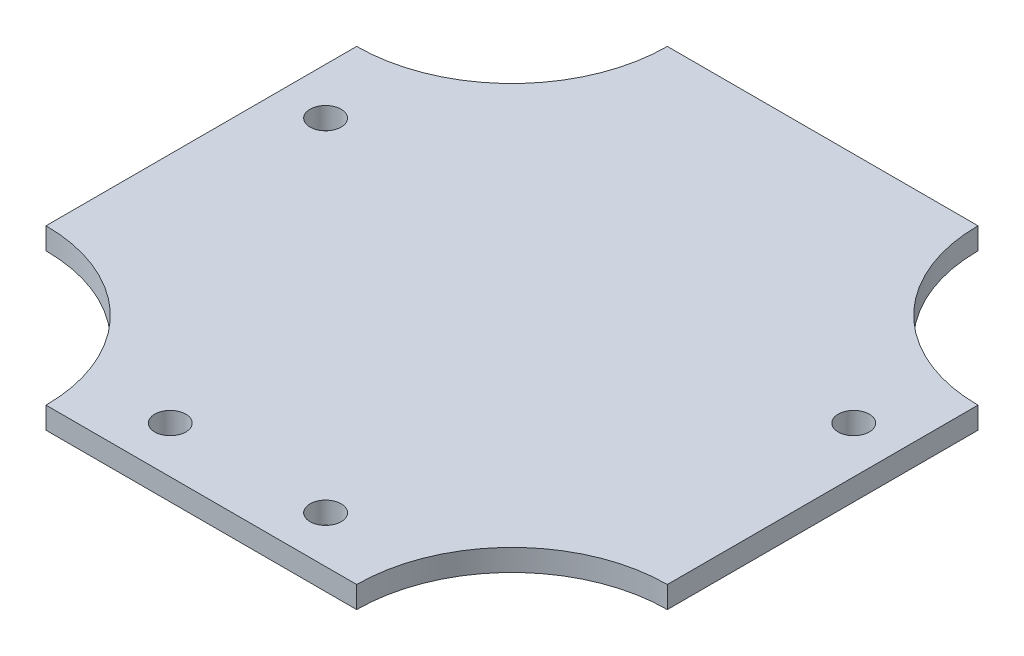
ISO-10303-21;
HEADER;
FILE_DESCRIPTION(('STEP AP214'),'2;1');
FILE_NAME('part.step','',(''),(''),'','','');
FILE_SCHEMA(('AUTOMOTIVE_DESIGN { 1 0 10303 214 1 1 1 1 }'));
ENDSEC;
DATA;
#1=APPLICATION_CONTEXT('core data for automotive mechanical design processes');
#2=APPLICATION_PROTOCOL_DEFINITION('international standard','automotive_design',2000,#1);
#3=PRODUCT_CONTEXT('',#1,'mechanical');
#4=PRODUCT('Part','Part','',(#3));
#5=PRODUCT_RELATED_PRODUCT_CATEGORY('part','',(#4));
#6=PRODUCT_DEFINITION_FORMATION('','',#4);
#7=PRODUCT_DEFINITION_CONTEXT('part definition',#1,'design');
#8=PRODUCT_DEFINITION('design','',#6,#7);
#9=PRODUCT_DEFINITION_SHAPE('','',#8);
#10=(LENGTH_UNIT() NAMED_UNIT(*) SI_UNIT(.MILLI.,.METRE.));
#11=(NAMED_UNIT(*) PLANE_ANGLE_UNIT() SI_UNIT($,.RADIAN.));
#12=(NAMED_UNIT(*) SI_UNIT($,.STERADIAN.) SOLID_ANGLE_UNIT());
#13=UNCERTAINTY_MEASURE_WITH_UNIT(LENGTH_MEASURE(1.E-05),#10,'distance_accuracy_value','');
#14=(GEOMETRIC_REPRESENTATION_CONTEXT(3) GLOBAL_UNCERTAINTY_ASSIGNED_CONTEXT((#13)) GLOBAL_UNIT_ASSIGNED_CONTEXT((#10,
#11,#12)) REPRESENTATION_CONTEXT('',''));
#15=CARTESIAN_POINT('',(0.,0.,0.));
#16=DIRECTION('',(0.,0.,1.));
#17=DIRECTION('',(1.,0.,0.));
#18=AXIS2_PLACEMENT_3D('',#15,#16,#17);
#19=CARTESIAN_POINT('',(-100.,7.,-100.));
#20=DIRECTION('',(0.,1.,0.));
#21=DIRECTION('',(0.,0.,1.));
#22=AXIS2_PLACEMENT_3D('',#19,#20,#21);
#23=PLANE('',#22);
#24=CARTESIAN_POINT('',(-25.,7.,85.));
#25=DIRECTION('',(0.,1.,0.));
#26=DIRECTION('',(0.,0.,1.));
#27=AXIS2_PLACEMENT_3D('',#24,#25,#26);
#28=CIRCLE('',#27,5.);
#29=CARTESIAN_POINT('',(-25.,7.,90.));
#30=VERTEX_POINT('',#29);
#31=EDGE_CURVE('E192',#30,#30,#28,.T.);
#32=ORIENTED_EDGE('',*,*,#31,.F.);
#33=EDGE_LOOP('',(#32));
#34=FACE_BOUND('',#33,.T.);
#35=CARTESIAN_POINT('',(-85.,7.,-25.));
#36=DIRECTION('',(0.,1.,0.));
#37=DIRECTION('',(0.,0.,1.));
#38=AXIS2_PLACEMENT_3D('',#35,#36,#37);
#39=CIRCLE('',#38,5.);
#40=CARTESIAN_POINT('',(-85.,7.,-20.));
#41=VERTEX_POINT('',#40);
#42=EDGE_CURVE('E138',#41,#41,#39,.T.);
#43=ORIENTED_EDGE('',*,*,#42,.F.);
#44=EDGE_LOOP('',(#43));
#45=FACE_BOUND('',#44,.T.);
#46=CARTESIAN_POINT('',(-100.,7.,-100.));
#47=DIRECTION('',(0.,-1.,0.));
#48=DIRECTION('',(0.,0.,1.));
#49=AXIS2_PLACEMENT_3D('',#46,#47,#48);
#50=CIRCLE('',#49,50.);
#51=CARTESIAN_POINT('',(-50.,7.,-100.));
#52=VERTEX_POINT('',#51);
#53=CARTESIAN_POINT('',(-100.,7.,-50.));
#54=VERTEX_POINT('',#53);
#55=EDGE_CURVE('E149',#52,#54,#50,.T.);
#56=ORIENTED_EDGE('',*,*,#55,.T.);
#57=DIRECTION('',(0.,0.,1.));
#58=VECTOR('',#57,1.);
#59=CARTESIAN_POINT('',(-100.,7.,-50.));
#60=LINE('',#59,#58);
#61=CARTESIAN_POINT('',(-100.,7.,50.));
#62=VERTEX_POINT('',#61);
#63=EDGE_CURVE('E97',#54,#62,#60,.T.);
#64=ORIENTED_EDGE('',*,*,#63,.T.);
#65=CARTESIAN_POINT('',(-100.,7.,100.));
#66=DIRECTION('',(0.,-1.,0.));
#67=DIRECTION('',(0.,0.,-1.));
#68=AXIS2_PLACEMENT_3D('',#65,#66,#67);
#69=CIRCLE('',#68,50.);
#70=CARTESIAN_POINT('',(-50.,7.,100.));
#71=VERTEX_POINT('',#70);
#72=EDGE_CURVE('E164',#62,#71,#69,.T.);
#73=ORIENTED_EDGE('',*,*,#72,.T.);
#74=DIRECTION('',(1.,0.,0.));
#75=VECTOR('',#74,1.);
#76=CARTESIAN_POINT('',(-50.,7.,100.));
#77=LINE('',#76,#75);
#78=CARTESIAN_POINT('',(50.,7.,100.));
#79=VERTEX_POINT('',#78);
#80=EDGE_CURVE('E177',#71,#79,#77,.T.);
#81=ORIENTED_EDGE('',*,*,#80,.T.);
#82=CARTESIAN_POINT('',(100.,7.,100.));
#83=DIRECTION('',(0.,-1.,0.));
#84=DIRECTION('',(0.,0.,-1.));
#85=AXIS2_PLACEMENT_3D('',#82,#83,#84);
#86=CIRCLE('',#85,50.);
#87=CARTESIAN_POINT('',(100.,7.,50.));
#88=VERTEX_POINT('',#87);
#89=EDGE_CURVE('E116',#79,#88,#86,.T.);
#90=ORIENTED_EDGE('',*,*,#89,.T.);
#91=DIRECTION('',(0.,0.,-1.));
#92=VECTOR('',#91,1.);
#93=CARTESIAN_POINT('',(100.,7.,-50.));
#94=LINE('',#93,#92);
#95=CARTESIAN_POINT('',(100.,7.,-50.));
#96=VERTEX_POINT('',#95);
#97=EDGE_CURVE('E110',#88,#96,#94,.T.);
#98=ORIENTED_EDGE('',*,*,#97,.T.);
#99=CARTESIAN_POINT('',(100.,7.,-100.));
#100=DIRECTION('',(0.,-1.,0.));
#101=DIRECTION('',(0.,0.,1.));
#102=AXIS2_PLACEMENT_3D('',#99,#100,#101);
#103=CIRCLE('',#102,50.);
#104=CARTESIAN_POINT('',(50.,7.,-100.));
#105=VERTEX_POINT('',#104);
#106=EDGE_CURVE('E114',#96,#105,#103,.T.);
#107=ORIENTED_EDGE('',*,*,#106,.T.);
#108=DIRECTION('',(-1.,0.,0.));
#109=VECTOR('',#108,1.);
#110=CARTESIAN_POINT('',(-50.,7.,-100.));
#111=LINE('',#110,#109);
#112=EDGE_CURVE('E54',#105,#52,#111,.T.);
#113=ORIENTED_EDGE('',*,*,#112,.T.);
#114=EDGE_LOOP('',(#56,#64,#73,#81,#90,#98,#107,#113));
#115=FACE_BOUND('',#114,.T.);
#116=CARTESIAN_POINT('',(85.,7.,-25.));
#117=DIRECTION('',(0.,1.,0.));
#118=DIRECTION('',(0.,0.,1.));
#119=AXIS2_PLACEMENT_3D('',#116,#117,#118);
#120=CIRCLE('',#119,5.);
#121=CARTESIAN_POINT('',(85.,7.,-20.));
#122=VERTEX_POINT('',#121);
#123=EDGE_CURVE('E186',#122,#122,#120,.T.);
#124=ORIENTED_EDGE('',*,*,#123,.F.);
#125=EDGE_LOOP('',(#124));
#126=FACE_BOUND('',#125,.T.);
#127=CARTESIAN_POINT('',(25.,7.,85.));
#128=DIRECTION('',(0.,1.,0.));
#129=DIRECTION('',(0.,0.,1.));
#130=AXIS2_PLACEMENT_3D('',#127,#128,#129);
#131=CIRCLE('',#130,5.);
#132=CARTESIAN_POINT('',(25.,7.,90.));
#133=VERTEX_POINT('',#132);
#134=EDGE_CURVE('E198',#133,#133,#131,.T.);
#135=ORIENTED_EDGE('',*,*,#134,.F.);
#136=EDGE_LOOP('',(#135));
#137=FACE_BOUND('',#136,.T.);
#138=ADVANCED_FACE('F37',(#34,#45,#115,#126,#137),#23,.T.);
#139=CARTESIAN_POINT('',(-100.,0.,-100.));
#140=DIRECTION('',(0.,1.,0.));
#141=DIRECTION('',(0.,0.,1.));
#142=AXIS2_PLACEMENT_3D('',#139,#140,#141);
#143=PLANE('',#142);
#144=CARTESIAN_POINT('',(-100.,0.,-100.));
#145=DIRECTION('',(0.,-1.,0.));
#146=DIRECTION('',(0.,0.,1.));
#147=AXIS2_PLACEMENT_3D('',#144,#145,#146);
#148=CIRCLE('',#147,50.);
#149=CARTESIAN_POINT('',(-50.,0.,-100.));
#150=VERTEX_POINT('',#149);
#151=CARTESIAN_POINT('',(-100.,0.,-50.));
#152=VERTEX_POINT('',#151);
#153=EDGE_CURVE('E134',#150,#152,#148,.T.);
#154=ORIENTED_EDGE('',*,*,#153,.F.);
#155=DIRECTION('',(-1.,0.,0.));
#156=VECTOR('',#155,1.);
#157=CARTESIAN_POINT('',(-50.,0.,-100.));
#158=LINE('',#157,#156);
#159=CARTESIAN_POINT('',(50.,0.,-100.));
#160=VERTEX_POINT('',#159);
#161=EDGE_CURVE('E89',#160,#150,#158,.T.);
#162=ORIENTED_EDGE('',*,*,#161,.F.);
#163=CARTESIAN_POINT('',(100.,0.,-100.));
#164=DIRECTION('',(0.,-1.,0.));
#165=DIRECTION('',(0.,0.,1.));
#166=AXIS2_PLACEMENT_3D('',#163,#164,#165);
#167=CIRCLE('',#166,50.);
#168=CARTESIAN_POINT('',(100.,0.,-50.));
#169=VERTEX_POINT('',#168);
#170=EDGE_CURVE('E83',#169,#160,#167,.T.);
#171=ORIENTED_EDGE('',*,*,#170,.F.);
#172=DIRECTION('',(0.,0.,-1.));
#173=VECTOR('',#172,1.);
#174=CARTESIAN_POINT('',(100.,0.,-50.));
#175=LINE('',#174,#173);
#176=CARTESIAN_POINT('',(100.,0.,50.));
#177=VERTEX_POINT('',#176);
#178=EDGE_CURVE('E124',#177,#169,#175,.T.);
#179=ORIENTED_EDGE('',*,*,#178,.F.);
#180=CARTESIAN_POINT('',(100.,0.,100.));
#181=DIRECTION('',(0.,-1.,0.));
#182=DIRECTION('',(0.,0.,-1.));
#183=AXIS2_PLACEMENT_3D('',#180,#181,#182);
#184=CIRCLE('',#183,50.);
#185=CARTESIAN_POINT('',(50.,0.,100.));
#186=VERTEX_POINT('',#185);
#187=EDGE_CURVE('E144',#186,#177,#184,.T.);
#188=ORIENTED_EDGE('',*,*,#187,.F.);
#189=DIRECTION('',(1.,0.,0.));
#190=VECTOR('',#189,1.);
#191=CARTESIAN_POINT('',(-50.,0.,100.));
#192=LINE('',#191,#190);
#193=CARTESIAN_POINT('',(-50.,0.,100.));
#194=VERTEX_POINT('',#193);
#195=EDGE_CURVE('E142',#194,#186,#192,.T.);
#196=ORIENTED_EDGE('',*,*,#195,.F.);
#197=CARTESIAN_POINT('',(-100.,0.,100.));
#198=DIRECTION('',(0.,-1.,0.));
#199=DIRECTION('',(0.,0.,-1.));
#200=AXIS2_PLACEMENT_3D('',#197,#198,#199);
#201=CIRCLE('',#200,50.);
#202=CARTESIAN_POINT('',(-100.,0.,50.));
#203=VERTEX_POINT('',#202);
#204=EDGE_CURVE('E140',#203,#194,#201,.T.);
#205=ORIENTED_EDGE('',*,*,#204,.F.);
#206=DIRECTION('',(0.,0.,1.));
#207=VECTOR('',#206,1.);
#208=CARTESIAN_POINT('',(-100.,0.,-50.));
#209=LINE('',#208,#207);
#210=EDGE_CURVE('E137',#152,#203,#209,.T.);
#211=ORIENTED_EDGE('',*,*,#210,.F.);
#212=EDGE_LOOP('',(#154,#162,#171,#179,#188,#196,#205,#211));
#213=FACE_BOUND('',#212,.T.);
#214=CARTESIAN_POINT('',(-85.,0.,-25.));
#215=DIRECTION('',(0.,1.,0.));
#216=DIRECTION('',(0.,0.,1.));
#217=AXIS2_PLACEMENT_3D('',#214,#215,#216);
#218=CIRCLE('',#217,5.);
#219=CARTESIAN_POINT('',(-85.,0.,-20.));
#220=VERTEX_POINT('',#219);
#221=EDGE_CURVE('E183',#220,#220,#218,.T.);
#222=ORIENTED_EDGE('',*,*,#221,.T.);
#223=EDGE_LOOP('',(#222));
#224=FACE_BOUND('',#223,.T.);
#225=CARTESIAN_POINT('',(85.,0.,-25.));
#226=DIRECTION('',(0.,1.,0.));
#227=DIRECTION('',(0.,0.,1.));
#228=AXIS2_PLACEMENT_3D('',#225,#226,#227);
#229=CIRCLE('',#228,5.);
#230=CARTESIAN_POINT('',(85.,0.,-20.));
#231=VERTEX_POINT('',#230);
#232=EDGE_CURVE('E189',#231,#231,#229,.T.);
#233=ORIENTED_EDGE('',*,*,#232,.T.);
#234=EDGE_LOOP('',(#233));
#235=FACE_BOUND('',#234,.T.);
#236=CARTESIAN_POINT('',(-25.,0.,85.));
#237=DIRECTION('',(0.,1.,0.));
#238=DIRECTION('',(0.,0.,1.));
#239=AXIS2_PLACEMENT_3D('',#236,#237,#238);
#240=CIRCLE('',#239,5.);
#241=CARTESIAN_POINT('',(-25.,0.,90.));
#242=VERTEX_POINT('',#241);
#243=EDGE_CURVE('E195',#242,#242,#240,.T.);
#244=ORIENTED_EDGE('',*,*,#243,.T.);
#245=EDGE_LOOP('',(#244));
#246=FACE_BOUND('',#245,.T.);
#247=CARTESIAN_POINT('',(25.,0.,85.));
#248=DIRECTION('',(0.,1.,0.));
#249=DIRECTION('',(0.,0.,1.));
#250=AXIS2_PLACEMENT_3D('',#247,#248,#249);
#251=CIRCLE('',#250,5.);
#252=CARTESIAN_POINT('',(25.,0.,90.));
#253=VERTEX_POINT('',#252);
#254=EDGE_CURVE('E201',#253,#253,#251,.T.);
#255=ORIENTED_EDGE('',*,*,#254,.T.);
#256=EDGE_LOOP('',(#255));
#257=FACE_BOUND('',#256,.T.);
#258=ADVANCED_FACE('F168',(#213,#224,#235,#246,#257),#143,.F.);
#259=CARTESIAN_POINT('',(-100.,7.,-100.));
#260=DIRECTION('',(0.,-1.,0.));
#261=DIRECTION('',(0.,0.,-1.));
#262=AXIS2_PLACEMENT_3D('',#259,#260,#261);
#263=CYLINDRICAL_SURFACE('',#262,50.);
#264=ORIENTED_EDGE('',*,*,#153,.T.);
#265=DIRECTION('',(0.,-1.,0.));
#266=VECTOR('',#265,1.);
#267=CARTESIAN_POINT('',(-100.,7.,-50.));
#268=LINE('',#267,#266);
#269=EDGE_CURVE('E11',#54,#152,#268,.T.);
#270=ORIENTED_EDGE('',*,*,#269,.F.);
#271=ORIENTED_EDGE('',*,*,#55,.F.);
#272=DIRECTION('',(0.,-1.,0.));
#273=VECTOR('',#272,1.);
#274=CARTESIAN_POINT('',(-50.,7.,-100.));
#275=LINE('',#274,#273);
#276=EDGE_CURVE('E130',#52,#150,#275,.T.);
#277=ORIENTED_EDGE('',*,*,#276,.T.);
#278=EDGE_LOOP('',(#264,#270,#271,#277));
#279=FACE_BOUND('',#278,.T.);
#280=ADVANCED_FACE('F39',(#279),#263,.F.);
#281=CARTESIAN_POINT('',(-100.,7.,-50.));
#282=DIRECTION('',(1.,0.,0.));
#283=DIRECTION('',(0.,0.,-1.));
#284=AXIS2_PLACEMENT_3D('',#281,#282,#283);
#285=PLANE('',#284);
#286=ORIENTED_EDGE('',*,*,#210,.T.);
#287=DIRECTION('',(0.,-1.,0.));
#288=VECTOR('',#287,1.);
#289=CARTESIAN_POINT('',(-100.,7.,50.));
#290=LINE('',#289,#288);
#291=EDGE_CURVE('E46',#62,#203,#290,.T.);
#292=ORIENTED_EDGE('',*,*,#291,.F.);
#293=ORIENTED_EDGE('',*,*,#63,.F.);
#294=ORIENTED_EDGE('',*,*,#269,.T.);
#295=EDGE_LOOP('',(#286,#292,#293,#294));
#296=FACE_BOUND('',#295,.T.);
#297=ADVANCED_FACE('F235',(#296),#285,.F.);
#298=CARTESIAN_POINT('',(-100.,7.,100.));
#299=DIRECTION('',(0.,-1.,0.));
#300=DIRECTION('',(0.,0.,-1.));
#301=AXIS2_PLACEMENT_3D('',#298,#299,#300);
#302=CYLINDRICAL_SURFACE('',#301,50.);
#303=ORIENTED_EDGE('',*,*,#204,.T.);
#304=DIRECTION('',(0.,-1.,0.));
#305=VECTOR('',#304,1.);
#306=CARTESIAN_POINT('',(-50.,7.,100.));
#307=LINE('',#306,#305);
#308=EDGE_CURVE('E156',#71,#194,#307,.T.);
#309=ORIENTED_EDGE('',*,*,#308,.F.);
#310=ORIENTED_EDGE('',*,*,#72,.F.);
#311=ORIENTED_EDGE('',*,*,#291,.T.);
#312=EDGE_LOOP('',(#303,#309,#310,#311));
#313=FACE_BOUND('',#312,.T.);
#314=ADVANCED_FACE('F162',(#313),#302,.F.);
#315=CARTESIAN_POINT('',(-50.,7.,100.));
#316=DIRECTION('',(0.,0.,-1.));
#317=DIRECTION('',(-1.,0.,0.));
#318=AXIS2_PLACEMENT_3D('',#315,#316,#317);
#319=PLANE('',#318);
#320=ORIENTED_EDGE('',*,*,#195,.T.);
#321=DIRECTION('',(0.,-1.,0.));
#322=VECTOR('',#321,1.);
#323=CARTESIAN_POINT('',(50.,7.,100.));
#324=LINE('',#323,#322);
#325=EDGE_CURVE('E153',#79,#186,#324,.T.);
#326=ORIENTED_EDGE('',*,*,#325,.F.);
#327=ORIENTED_EDGE('',*,*,#80,.F.);
#328=ORIENTED_EDGE('',*,*,#308,.T.);
#329=EDGE_LOOP('',(#320,#326,#327,#328));
#330=FACE_BOUND('',#329,.T.);
#331=ADVANCED_FACE('F173',(#330),#319,.F.);
#332=CARTESIAN_POINT('',(100.,7.,100.));
#333=DIRECTION('',(0.,-1.,0.));
#334=DIRECTION('',(0.,0.,-1.));
#335=AXIS2_PLACEMENT_3D('',#332,#333,#334);
#336=CYLINDRICAL_SURFACE('',#335,50.);
#337=ORIENTED_EDGE('',*,*,#187,.T.);
#338=DIRECTION('',(0.,-1.,0.));
#339=VECTOR('',#338,1.);
#340=CARTESIAN_POINT('',(100.,7.,50.));
#341=LINE('',#340,#339);
#342=EDGE_CURVE('E125',#88,#177,#341,.T.);
#343=ORIENTED_EDGE('',*,*,#342,.F.);
#344=ORIENTED_EDGE('',*,*,#89,.F.);
#345=ORIENTED_EDGE('',*,*,#325,.T.);
#346=EDGE_LOOP('',(#337,#343,#344,#345));
#347=FACE_BOUND('',#346,.T.);
#348=ADVANCED_FACE('F176',(#347),#336,.F.);
#349=CARTESIAN_POINT('',(100.,7.,-50.));
#350=DIRECTION('',(-1.,0.,0.));
#351=DIRECTION('',(0.,0.,1.));
#352=AXIS2_PLACEMENT_3D('',#349,#350,#351);
#353=PLANE('',#352);
#354=ORIENTED_EDGE('',*,*,#178,.T.);
#355=DIRECTION('',(0.,-1.,0.));
#356=VECTOR('',#355,1.);
#357=CARTESIAN_POINT('',(100.,7.,-50.));
#358=LINE('',#357,#356);
#359=EDGE_CURVE('E121',#96,#169,#358,.T.);
#360=ORIENTED_EDGE('',*,*,#359,.F.);
#361=ORIENTED_EDGE('',*,*,#97,.F.);
#362=ORIENTED_EDGE('',*,*,#342,.T.);
#363=EDGE_LOOP('',(#354,#360,#361,#362));
#364=FACE_BOUND('',#363,.T.);
#365=ADVANCED_FACE('F122',(#364),#353,.F.);
#366=CARTESIAN_POINT('',(100.,7.,-100.));
#367=DIRECTION('',(0.,-1.,0.));
#368=DIRECTION('',(0.,0.,-1.));
#369=AXIS2_PLACEMENT_3D('',#366,#367,#368);
#370=CYLINDRICAL_SURFACE('',#369,50.);
#371=ORIENTED_EDGE('',*,*,#170,.T.);
#372=DIRECTION('',(0.,-1.,0.));
#373=VECTOR('',#372,1.);
#374=CARTESIAN_POINT('',(50.,7.,-100.));
#375=LINE('',#374,#373);
#376=EDGE_CURVE('E126',#105,#160,#375,.T.);
#377=ORIENTED_EDGE('',*,*,#376,.F.);
#378=ORIENTED_EDGE('',*,*,#106,.F.);
#379=ORIENTED_EDGE('',*,*,#359,.T.);
#380=EDGE_LOOP('',(#371,#377,#378,#379));
#381=FACE_BOUND('',#380,.T.);
#382=ADVANCED_FACE('F128',(#381),#370,.F.);
#383=CARTESIAN_POINT('',(-50.,7.,-100.));
#384=DIRECTION('',(0.,0.,1.));
#385=DIRECTION('',(1.,0.,0.));
#386=AXIS2_PLACEMENT_3D('',#383,#384,#385);
#387=PLANE('',#386);
#388=ORIENTED_EDGE('',*,*,#161,.T.);
#389=ORIENTED_EDGE('',*,*,#276,.F.);
#390=ORIENTED_EDGE('',*,*,#112,.F.);
#391=ORIENTED_EDGE('',*,*,#376,.T.);
#392=EDGE_LOOP('',(#388,#389,#390,#391));
#393=FACE_BOUND('',#392,.T.);
#394=ADVANCED_FACE('F223',(#393),#387,.F.);
#395=CARTESIAN_POINT('',(-85.,7.,-25.));
#396=DIRECTION('',(0.,-1.,0.));
#397=DIRECTION('',(0.,0.,-1.));
#398=AXIS2_PLACEMENT_3D('',#395,#396,#397);
#399=CYLINDRICAL_SURFACE('',#398,5.);
#400=ORIENTED_EDGE('',*,*,#42,.T.);
#401=EDGE_LOOP('',(#400));
#402=FACE_BOUND('',#401,.T.);
#403=ORIENTED_EDGE('',*,*,#221,.F.);
#404=EDGE_LOOP('',(#403));
#405=FACE_BOUND('',#404,.T.);
#406=ADVANCED_FACE('F220',(#402,#405),#399,.F.);
#407=CARTESIAN_POINT('',(85.,7.,-25.));
#408=DIRECTION('',(0.,-1.,0.));
#409=DIRECTION('',(0.,0.,-1.));
#410=AXIS2_PLACEMENT_3D('',#407,#408,#409);
#411=CYLINDRICAL_SURFACE('',#410,5.);
#412=ORIENTED_EDGE('',*,*,#123,.T.);
#413=EDGE_LOOP('',(#412));
#414=FACE_BOUND('',#413,.T.);
#415=ORIENTED_EDGE('',*,*,#232,.F.);
#416=EDGE_LOOP('',(#415));
#417=FACE_BOUND('',#416,.T.);
#418=ADVANCED_FACE('F311',(#414,#417),#411,.F.);
#419=CARTESIAN_POINT('',(-25.,7.,85.));
#420=DIRECTION('',(0.,-1.,0.));
#421=DIRECTION('',(0.,0.,-1.));
#422=AXIS2_PLACEMENT_3D('',#419,#420,#421);
#423=CYLINDRICAL_SURFACE('',#422,5.);
#424=ORIENTED_EDGE('',*,*,#31,.T.);
#425=EDGE_LOOP('',(#424));
#426=FACE_BOUND('',#425,.T.);
#427=ORIENTED_EDGE('',*,*,#243,.F.);
#428=EDGE_LOOP('',(#427));
#429=FACE_BOUND('',#428,.T.);
#430=ADVANCED_FACE('F320',(#426,#429),#423,.F.);
#431=CARTESIAN_POINT('',(25.,7.,85.));
#432=DIRECTION('',(0.,-1.,0.));
#433=DIRECTION('',(0.,0.,-1.));
#434=AXIS2_PLACEMENT_3D('',#431,#432,#433);
#435=CYLINDRICAL_SURFACE('',#434,5.);
#436=ORIENTED_EDGE('',*,*,#134,.T.);
#437=EDGE_LOOP('',(#436));
#438=FACE_BOUND('',#437,.T.);
#439=ORIENTED_EDGE('',*,*,#254,.F.);
#440=EDGE_LOOP('',(#439));
#441=FACE_BOUND('',#440,.T.);
#442=ADVANCED_FACE('F207',(#438,#441),#435,.F.);
#443=CLOSED_SHELL('',(#138,#258,#280,#297,#314,#331,#348,#365,#382,#394,#406,#418,#430,#442));
#444=MANIFOLD_SOLID_BREP('B2',#443);
#445=ADVANCED_BREP_SHAPE_REPRESENTATION('',(#18,#444),#14);
#446=SHAPE_DEFINITION_REPRESENTATION(#9,#445);
ENDSEC;
END-ISO-10303-21;
